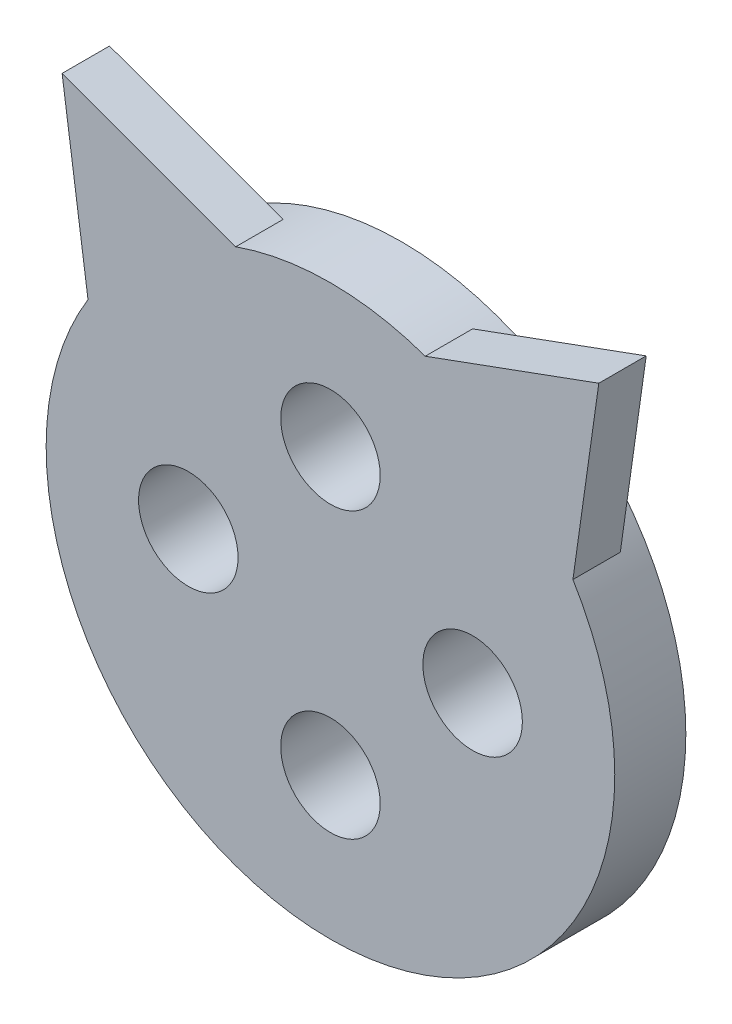
ISO-10303-21;
HEADER;
FILE_DESCRIPTION(('STEP AP214'),'2;1');
FILE_NAME('part.step','',(''),(''),'','','');
FILE_SCHEMA(('AUTOMOTIVE_DESIGN { 1 0 10303 214 1 1 1 1 }'));
ENDSEC;
DATA;
#1=APPLICATION_CONTEXT('core data for automotive mechanical design processes');
#2=APPLICATION_PROTOCOL_DEFINITION('international standard','automotive_design',2000,#1);
#3=PRODUCT_CONTEXT('',#1,'mechanical');
#4=PRODUCT('Part','Part','',(#3));
#5=PRODUCT_RELATED_PRODUCT_CATEGORY('part','',(#4));
#6=PRODUCT_DEFINITION_FORMATION('','',#4);
#7=PRODUCT_DEFINITION_CONTEXT('part definition',#1,'design');
#8=PRODUCT_DEFINITION('design','',#6,#7);
#9=PRODUCT_DEFINITION_SHAPE('','',#8);
#10=(LENGTH_UNIT() NAMED_UNIT(*) SI_UNIT(.MILLI.,.METRE.));
#11=(NAMED_UNIT(*) PLANE_ANGLE_UNIT() SI_UNIT($,.RADIAN.));
#12=(NAMED_UNIT(*) SI_UNIT($,.STERADIAN.) SOLID_ANGLE_UNIT());
#13=UNCERTAINTY_MEASURE_WITH_UNIT(LENGTH_MEASURE(1.E-05),#10,'distance_accuracy_value','');
#14=(GEOMETRIC_REPRESENTATION_CONTEXT(3) GLOBAL_UNCERTAINTY_ASSIGNED_CONTEXT((#13)) GLOBAL_UNIT_ASSIGNED_CONTEXT((#10,
#11,#12)) REPRESENTATION_CONTEXT('',''));
#15=CARTESIAN_POINT('',(0.,0.,0.));
#16=DIRECTION('',(0.,0.,1.));
#17=DIRECTION('',(1.,0.,0.));
#18=AXIS2_PLACEMENT_3D('',#15,#16,#17);
#19=CARTESIAN_POINT('',(0.,0.,3.));
#20=DIRECTION('',(0.,0.,-1.));
#21=DIRECTION('',(-1.,0.,0.));
#22=AXIS2_PLACEMENT_3D('',#19,#20,#21);
#23=CYLINDRICAL_SURFACE('',#22,12.);
#24=CARTESIAN_POINT('',(0.,0.,0.));
#25=DIRECTION('',(0.,0.,1.));
#26=DIRECTION('',(1.,0.,0.));
#27=AXIS2_PLACEMENT_3D('',#24,#25,#26);
#28=CIRCLE('',#27,12.);
#29=CARTESIAN_POINT('',(12.,0.,0.));
#30=VERTEX_POINT('',#29);
#31=EDGE_CURVE('E45',#30,#30,#28,.T.);
#32=ORIENTED_EDGE('',*,*,#31,.T.);
#33=EDGE_LOOP('',(#32));
#34=FACE_BOUND('',#33,.T.);
#35=DIRECTION('',(0.,0.,1.));
#36=VECTOR('',#35,1.);
#37=CARTESIAN_POINT('',(-10.2338441367074,6.26645307854284,-11.6454582010053));
#38=LINE('',#37,#36);
#39=CARTESIAN_POINT('',(-10.2338441367074,6.26645307854284,1.));
#40=VERTEX_POINT('',#39);
#41=CARTESIAN_POINT('',(-10.2338441367074,6.26645307854284,3.));
#42=VERTEX_POINT('',#41);
#43=EDGE_CURVE('E104',#40,#42,#38,.T.);
#44=ORIENTED_EDGE('',*,*,#43,.F.);
#45=CARTESIAN_POINT('',(0.,0.,1.));
#46=DIRECTION('',(0.,0.,1.));
#47=DIRECTION('',(1.,0.,0.));
#48=AXIS2_PLACEMENT_3D('',#45,#46,#47);
#49=CIRCLE('',#48,12.);
#50=CARTESIAN_POINT('',(-4.,11.3137084989848,1.));
#51=VERTEX_POINT('',#50);
#52=EDGE_CURVE('E57',#40,#51,#49,.F.);
#53=ORIENTED_EDGE('',*,*,#52,.T.);
#54=DIRECTION('',(0.,0.,1.));
#55=VECTOR('',#54,1.);
#56=CARTESIAN_POINT('',(-4.,11.3137084989848,-11.6454582010053));
#57=LINE('',#56,#55);
#58=CARTESIAN_POINT('',(-4.,11.3137084989848,3.));
#59=VERTEX_POINT('',#58);
#60=EDGE_CURVE('E123',#51,#59,#57,.T.);
#61=ORIENTED_EDGE('',*,*,#60,.T.);
#62=CARTESIAN_POINT('',(0.,0.,3.));
#63=DIRECTION('',(0.,0.,1.));
#64=DIRECTION('',(1.,0.,0.));
#65=AXIS2_PLACEMENT_3D('',#62,#63,#64);
#66=CIRCLE('',#65,12.);
#67=CARTESIAN_POINT('',(4.,11.3137084989848,3.));
#68=VERTEX_POINT('',#67);
#69=EDGE_CURVE('E12',#68,#59,#66,.T.);
#70=ORIENTED_EDGE('',*,*,#69,.F.);
#71=DIRECTION('',(0.,0.,1.));
#72=VECTOR('',#71,1.);
#73=CARTESIAN_POINT('',(4.,11.3137084989848,-11.6454582010053));
#74=LINE('',#73,#72);
#75=CARTESIAN_POINT('',(4.,11.3137084989848,1.));
#76=VERTEX_POINT('',#75);
#77=EDGE_CURVE('E138',#76,#68,#74,.T.);
#78=ORIENTED_EDGE('',*,*,#77,.F.);
#79=CARTESIAN_POINT('',(0.,0.,1.));
#80=DIRECTION('',(0.,0.,1.));
#81=DIRECTION('',(1.,0.,0.));
#82=AXIS2_PLACEMENT_3D('',#79,#80,#81);
#83=CIRCLE('',#82,12.);
#84=CARTESIAN_POINT('',(10.2338441367094,6.26645307853956,1.));
#85=VERTEX_POINT('',#84);
#86=EDGE_CURVE('E64',#76,#85,#83,.F.);
#87=ORIENTED_EDGE('',*,*,#86,.T.);
#88=DIRECTION('',(0.,0.,1.));
#89=VECTOR('',#88,1.);
#90=CARTESIAN_POINT('',(10.2338441367094,6.26645307853956,-11.6454582010053));
#91=LINE('',#90,#89);
#92=CARTESIAN_POINT('',(10.2338441367094,6.26645307853956,3.));
#93=VERTEX_POINT('',#92);
#94=EDGE_CURVE('E129',#85,#93,#91,.T.);
#95=ORIENTED_EDGE('',*,*,#94,.T.);
#96=EDGE_CURVE('E50',#42,#93,#66,.T.);
#97=ORIENTED_EDGE('',*,*,#96,.F.);
#98=EDGE_LOOP('',(#44,#53,#61,#70,#78,#87,#95,#97));
#99=FACE_BOUND('',#98,.T.);
#100=ADVANCED_FACE('F42',(#34,#99),#23,.T.);
#101=CARTESIAN_POINT('',(0.,0.,3.));
#102=DIRECTION('',(0.,0.,1.));
#103=DIRECTION('',(1.,0.,0.));
#104=AXIS2_PLACEMENT_3D('',#101,#102,#103);
#105=PLANE('',#104);
#106=CARTESIAN_POINT('',(0.,-6.,3.));
#107=DIRECTION('',(0.,0.,1.));
#108=DIRECTION('',(1.,0.,0.));
#109=AXIS2_PLACEMENT_3D('',#106,#107,#108);
#110=CIRCLE('',#109,2.1);
#111=CARTESIAN_POINT('',(2.1,-6.,3.));
#112=VERTEX_POINT('',#111);
#113=EDGE_CURVE('E149',#112,#112,#110,.T.);
#114=ORIENTED_EDGE('',*,*,#113,.F.);
#115=EDGE_LOOP('',(#114));
#116=FACE_BOUND('',#115,.T.);
#117=CARTESIAN_POINT('',(0.,6.,3.));
#118=DIRECTION('',(0.,0.,1.));
#119=DIRECTION('',(1.,0.,0.));
#120=AXIS2_PLACEMENT_3D('',#117,#118,#119);
#121=CIRCLE('',#120,2.1);
#122=CARTESIAN_POINT('',(2.1,6.,3.));
#123=VERTEX_POINT('',#122);
#124=EDGE_CURVE('E161',#123,#123,#121,.T.);
#125=ORIENTED_EDGE('',*,*,#124,.F.);
#126=EDGE_LOOP('',(#125));
#127=FACE_BOUND('',#126,.T.);
#128=ORIENTED_EDGE('',*,*,#96,.T.);
#129=DIRECTION('',(0.140105421163495,0.990136592072326,0.));
#130=VECTOR('',#129,1.);
#131=CARTESIAN_POINT('',(9.16365426582213,-1.29666719782828,3.));
#132=LINE('',#131,#130);
#133=CARTESIAN_POINT('',(11.3266664217847,13.9895184967037,3.));
#134=VERTEX_POINT('',#133);
#135=EDGE_CURVE('E131',#93,#134,#132,.T.);
#136=ORIENTED_EDGE('',*,*,#135,.T.);
#137=DIRECTION('',(-0.939316207921115,-0.343052563810121,0.));
#138=VECTOR('',#137,1.);
#139=CARTESIAN_POINT('',(-3.17493072665897,8.69331468465053,3.));
#140=LINE('',#139,#138);
#141=EDGE_CURVE('E134',#134,#68,#140,.T.);
#142=ORIENTED_EDGE('',*,*,#141,.T.);
#143=ORIENTED_EDGE('',*,*,#69,.T.);
#144=DIRECTION('',(0.939316207920971,-0.343052563810516,0.));
#145=VECTOR('',#144,1.);
#146=CARTESIAN_POINT('',(3.17493072666153,8.69331468464618,3.));
#147=LINE('',#146,#145);
#148=CARTESIAN_POINT('',(-11.3266664217805,13.9895184967057,3.));
#149=VERTEX_POINT('',#148);
#150=EDGE_CURVE('E100',#149,#59,#147,.T.);
#151=ORIENTED_EDGE('',*,*,#150,.F.);
#152=DIRECTION('',(-0.140105421163249,0.990136592072361,0.));
#153=VECTOR('',#152,1.);
#154=CARTESIAN_POINT('',(-9.1636542658219,-1.29666719782592,3.));
#155=LINE('',#154,#153);
#156=EDGE_CURVE('E105',#42,#149,#155,.T.);
#157=ORIENTED_EDGE('',*,*,#156,.F.);
#158=EDGE_LOOP('',(#128,#136,#142,#143,#151,#157));
#159=FACE_BOUND('',#158,.T.);
#160=CARTESIAN_POINT('',(6.,0.,3.));
#161=DIRECTION('',(0.,0.,1.));
#162=DIRECTION('',(1.,0.,0.));
#163=AXIS2_PLACEMENT_3D('',#160,#161,#162);
#164=CIRCLE('',#163,2.1);
#165=CARTESIAN_POINT('',(8.1,0.,3.));
#166=VERTEX_POINT('',#165);
#167=EDGE_CURVE('E155',#166,#166,#164,.T.);
#168=ORIENTED_EDGE('',*,*,#167,.F.);
#169=EDGE_LOOP('',(#168));
#170=FACE_BOUND('',#169,.T.);
#171=CARTESIAN_POINT('',(-6.,0.,3.));
#172=DIRECTION('',(0.,0.,1.));
#173=DIRECTION('',(1.,0.,0.));
#174=AXIS2_PLACEMENT_3D('',#171,#172,#173);
#175=CIRCLE('',#174,2.1);
#176=CARTESIAN_POINT('',(-3.9,0.,3.));
#177=VERTEX_POINT('',#176);
#178=EDGE_CURVE('E142',#177,#177,#175,.T.);
#179=ORIENTED_EDGE('',*,*,#178,.F.);
#180=EDGE_LOOP('',(#179));
#181=FACE_BOUND('',#180,.T.);
#182=ADVANCED_FACE('F113',(#116,#127,#159,#170,#181),#105,.T.);
#183=CARTESIAN_POINT('',(0.,0.,0.));
#184=DIRECTION('',(0.,0.,1.));
#185=DIRECTION('',(1.,0.,0.));
#186=AXIS2_PLACEMENT_3D('',#183,#184,#185);
#187=PLANE('',#186);
#188=ORIENTED_EDGE('',*,*,#31,.F.);
#189=EDGE_LOOP('',(#188));
#190=FACE_BOUND('',#189,.T.);
#191=CARTESIAN_POINT('',(0.,6.,0.));
#192=DIRECTION('',(0.,0.,1.));
#193=DIRECTION('',(1.,0.,0.));
#194=AXIS2_PLACEMENT_3D('',#191,#192,#193);
#195=CIRCLE('',#194,2.1);
#196=CARTESIAN_POINT('',(2.1,6.,0.));
#197=VERTEX_POINT('',#196);
#198=EDGE_CURVE('E158',#197,#197,#195,.T.);
#199=ORIENTED_EDGE('',*,*,#198,.T.);
#200=EDGE_LOOP('',(#199));
#201=FACE_BOUND('',#200,.T.);
#202=CARTESIAN_POINT('',(6.,0.,0.));
#203=DIRECTION('',(0.,0.,1.));
#204=DIRECTION('',(1.,0.,0.));
#205=AXIS2_PLACEMENT_3D('',#202,#203,#204);
#206=CIRCLE('',#205,2.1);
#207=CARTESIAN_POINT('',(8.1,0.,0.));
#208=VERTEX_POINT('',#207);
#209=EDGE_CURVE('E152',#208,#208,#206,.T.);
#210=ORIENTED_EDGE('',*,*,#209,.T.);
#211=EDGE_LOOP('',(#210));
#212=FACE_BOUND('',#211,.T.);
#213=CARTESIAN_POINT('',(0.,-6.,0.));
#214=DIRECTION('',(0.,0.,1.));
#215=DIRECTION('',(1.,0.,0.));
#216=AXIS2_PLACEMENT_3D('',#213,#214,#215);
#217=CIRCLE('',#216,2.1);
#218=CARTESIAN_POINT('',(2.1,-6.,0.));
#219=VERTEX_POINT('',#218);
#220=EDGE_CURVE('E145',#219,#219,#217,.T.);
#221=ORIENTED_EDGE('',*,*,#220,.T.);
#222=EDGE_LOOP('',(#221));
#223=FACE_BOUND('',#222,.T.);
#224=CARTESIAN_POINT('',(-6.,0.,0.));
#225=DIRECTION('',(0.,0.,1.));
#226=DIRECTION('',(1.,0.,0.));
#227=AXIS2_PLACEMENT_3D('',#224,#225,#226);
#228=CIRCLE('',#227,2.1);
#229=CARTESIAN_POINT('',(-3.9,0.,0.));
#230=VERTEX_POINT('',#229);
#231=EDGE_CURVE('E146',#230,#230,#228,.T.);
#232=ORIENTED_EDGE('',*,*,#231,.T.);
#233=EDGE_LOOP('',(#232));
#234=FACE_BOUND('',#233,.T.);
#235=ADVANCED_FACE('F170',(#190,#201,#212,#223,#234),#187,.F.);
#236=CARTESIAN_POINT('',(0.,6.,3.));
#237=DIRECTION('',(0.,0.,-1.));
#238=DIRECTION('',(-1.,0.,0.));
#239=AXIS2_PLACEMENT_3D('',#236,#237,#238);
#240=CYLINDRICAL_SURFACE('',#239,2.1);
#241=ORIENTED_EDGE('',*,*,#124,.T.);
#242=EDGE_LOOP('',(#241));
#243=FACE_BOUND('',#242,.T.);
#244=ORIENTED_EDGE('',*,*,#198,.F.);
#245=EDGE_LOOP('',(#244));
#246=FACE_BOUND('',#245,.T.);
#247=ADVANCED_FACE('F173',(#243,#246),#240,.F.);
#248=CARTESIAN_POINT('',(6.,0.,3.));
#249=DIRECTION('',(0.,0.,-1.));
#250=DIRECTION('',(-1.,0.,0.));
#251=AXIS2_PLACEMENT_3D('',#248,#249,#250);
#252=CYLINDRICAL_SURFACE('',#251,2.1);
#253=ORIENTED_EDGE('',*,*,#167,.T.);
#254=EDGE_LOOP('',(#253));
#255=FACE_BOUND('',#254,.T.);
#256=ORIENTED_EDGE('',*,*,#209,.F.);
#257=EDGE_LOOP('',(#256));
#258=FACE_BOUND('',#257,.T.);
#259=ADVANCED_FACE('F196',(#255,#258),#252,.F.);
#260=CARTESIAN_POINT('',(0.,-6.,3.));
#261=DIRECTION('',(0.,0.,-1.));
#262=DIRECTION('',(-1.,0.,0.));
#263=AXIS2_PLACEMENT_3D('',#260,#261,#262);
#264=CYLINDRICAL_SURFACE('',#263,2.1);
#265=ORIENTED_EDGE('',*,*,#113,.T.);
#266=EDGE_LOOP('',(#265));
#267=FACE_BOUND('',#266,.T.);
#268=ORIENTED_EDGE('',*,*,#220,.F.);
#269=EDGE_LOOP('',(#268));
#270=FACE_BOUND('',#269,.T.);
#271=ADVANCED_FACE('F185',(#267,#270),#264,.F.);
#272=CARTESIAN_POINT('',(-6.,0.,3.));
#273=DIRECTION('',(0.,0.,-1.));
#274=DIRECTION('',(-1.,0.,0.));
#275=AXIS2_PLACEMENT_3D('',#272,#273,#274);
#276=CYLINDRICAL_SURFACE('',#275,2.1);
#277=ORIENTED_EDGE('',*,*,#178,.T.);
#278=EDGE_LOOP('',(#277));
#279=FACE_BOUND('',#278,.T.);
#280=ORIENTED_EDGE('',*,*,#231,.F.);
#281=EDGE_LOOP('',(#280));
#282=FACE_BOUND('',#281,.T.);
#283=ADVANCED_FACE('F182',(#279,#282),#276,.F.);
#284=CARTESIAN_POINT('',(9.16365426582213,-1.29666719782828,-11.6454582010053));
#285=DIRECTION('',(0.990136592072326,-0.140105421163495,0.));
#286=DIRECTION('',(0.140105421163495,0.990136592072326,0.));
#287=AXIS2_PLACEMENT_3D('',#284,#285,#286);
#288=PLANE('',#287);
#289=DIRECTION('',(-0.140105421163495,-0.990136592072326,0.));
#290=VECTOR('',#289,1.);
#291=CARTESIAN_POINT('',(9.16365426582213,-1.29666719782828,1.));
#292=LINE('',#291,#290);
#293=CARTESIAN_POINT('',(11.3266664217847,13.9895184967037,1.));
#294=VERTEX_POINT('',#293);
#295=EDGE_CURVE('E118',#294,#85,#292,.T.);
#296=ORIENTED_EDGE('',*,*,#295,.F.);
#297=DIRECTION('',(0.,0.,1.));
#298=VECTOR('',#297,1.);
#299=CARTESIAN_POINT('',(11.3266664217847,13.9895184967037,-11.6454582010053));
#300=LINE('',#299,#298);
#301=EDGE_CURVE('E136',#294,#134,#300,.T.);
#302=ORIENTED_EDGE('',*,*,#301,.T.);
#303=ORIENTED_EDGE('',*,*,#135,.F.);
#304=ORIENTED_EDGE('',*,*,#94,.F.);
#305=EDGE_LOOP('',(#296,#302,#303,#304));
#306=FACE_BOUND('',#305,.T.);
#307=ADVANCED_FACE('F184',(#306),#288,.T.);
#308=CARTESIAN_POINT('',(-3.17493072665897,8.69331468465053,-11.6454582010053));
#309=DIRECTION('',(-0.343052563810121,0.939316207921115,0.));
#310=DIRECTION('',(-0.939316207921115,-0.343052563810121,0.));
#311=AXIS2_PLACEMENT_3D('',#308,#309,#310);
#312=PLANE('',#311);
#313=DIRECTION('',(0.939316207921115,0.343052563810121,0.));
#314=VECTOR('',#313,1.);
#315=CARTESIAN_POINT('',(-3.17493072665897,8.69331468465053,1.));
#316=LINE('',#315,#314);
#317=EDGE_CURVE('E116',#76,#294,#316,.T.);
#318=ORIENTED_EDGE('',*,*,#317,.F.);
#319=ORIENTED_EDGE('',*,*,#77,.T.);
#320=ORIENTED_EDGE('',*,*,#141,.F.);
#321=ORIENTED_EDGE('',*,*,#301,.F.);
#322=EDGE_LOOP('',(#318,#319,#320,#321));
#323=FACE_BOUND('',#322,.T.);
#324=ADVANCED_FACE('F193',(#323),#312,.T.);
#325=CARTESIAN_POINT('',(0.,0.,1.));
#326=DIRECTION('',(0.,0.,1.));
#327=DIRECTION('',(1.,0.,0.));
#328=AXIS2_PLACEMENT_3D('',#325,#326,#327);
#329=PLANE('',#328);
#330=ORIENTED_EDGE('',*,*,#295,.T.);
#331=ORIENTED_EDGE('',*,*,#86,.F.);
#332=ORIENTED_EDGE('',*,*,#317,.T.);
#333=EDGE_LOOP('',(#330,#331,#332));
#334=FACE_BOUND('',#333,.T.);
#335=ADVANCED_FACE('F261',(#334),#329,.F.);
#336=CARTESIAN_POINT('',(-9.1636542658219,-1.29666719782592,-11.6454582010053));
#337=DIRECTION('',(0.990136592072361,0.140105421163249,0.));
#338=DIRECTION('',(-0.140105421163249,0.990136592072361,0.));
#339=AXIS2_PLACEMENT_3D('',#336,#337,#338);
#340=PLANE('',#339);
#341=DIRECTION('',(0.,0.,1.));
#342=VECTOR('',#341,1.);
#343=CARTESIAN_POINT('',(-11.3266664217805,13.9895184967057,-11.6454582010053));
#344=LINE('',#343,#342);
#345=CARTESIAN_POINT('',(-11.3266664217805,13.9895184967057,1.));
#346=VERTEX_POINT('',#345);
#347=EDGE_CURVE('E95',#346,#149,#344,.T.);
#348=ORIENTED_EDGE('',*,*,#347,.F.);
#349=DIRECTION('',(0.140105421163249,-0.990136592072361,0.));
#350=VECTOR('',#349,1.);
#351=CARTESIAN_POINT('',(-9.1636542658219,-1.29666719782592,1.));
#352=LINE('',#351,#350);
#353=EDGE_CURVE('E125',#346,#40,#352,.T.);
#354=ORIENTED_EDGE('',*,*,#353,.T.);
#355=ORIENTED_EDGE('',*,*,#43,.T.);
#356=ORIENTED_EDGE('',*,*,#156,.T.);
#357=EDGE_LOOP('',(#348,#354,#355,#356));
#358=FACE_BOUND('',#357,.T.);
#359=ADVANCED_FACE('F109',(#358),#340,.F.);
#360=CARTESIAN_POINT('',(3.17493072666153,8.69331468464618,-11.6454582010053));
#361=DIRECTION('',(-0.343052563810516,-0.939316207920971,0.));
#362=DIRECTION('',(0.939316207920971,-0.343052563810516,0.));
#363=AXIS2_PLACEMENT_3D('',#360,#361,#362);
#364=PLANE('',#363);
#365=ORIENTED_EDGE('',*,*,#60,.F.);
#366=DIRECTION('',(-0.939316207920971,0.343052563810516,0.));
#367=VECTOR('',#366,1.);
#368=CARTESIAN_POINT('',(3.17493072666153,8.69331468464618,1.));
#369=LINE('',#368,#367);
#370=EDGE_CURVE('E101',#51,#346,#369,.T.);
#371=ORIENTED_EDGE('',*,*,#370,.T.);
#372=ORIENTED_EDGE('',*,*,#347,.T.);
#373=ORIENTED_EDGE('',*,*,#150,.T.);
#374=EDGE_LOOP('',(#365,#371,#372,#373));
#375=FACE_BOUND('',#374,.T.);
#376=ADVANCED_FACE('F98',(#375),#364,.F.);
#377=CARTESIAN_POINT('',(0.,0.,1.));
#378=DIRECTION('',(0.,0.,1.));
#379=DIRECTION('',(1.,0.,0.));
#380=AXIS2_PLACEMENT_3D('',#377,#378,#379);
#381=PLANE('',#380);
#382=ORIENTED_EDGE('',*,*,#52,.F.);
#383=ORIENTED_EDGE('',*,*,#353,.F.);
#384=ORIENTED_EDGE('',*,*,#370,.F.);
#385=EDGE_LOOP('',(#382,#383,#384));
#386=FACE_BOUND('',#385,.T.);
#387=ADVANCED_FACE('F288',(#386),#381,.F.);
#388=CLOSED_SHELL('',(#100,#182,#235,#247,#259,#271,#283,#307,#324,#335,#359,#376,#387));
#389=MANIFOLD_SOLID_BREP('B2',#388);
#390=ADVANCED_BREP_SHAPE_REPRESENTATION('',(#18,#389),#14);
#391=SHAPE_DEFINITION_REPRESENTATION(#9,#390);
ENDSEC;
END-ISO-10303-21;
